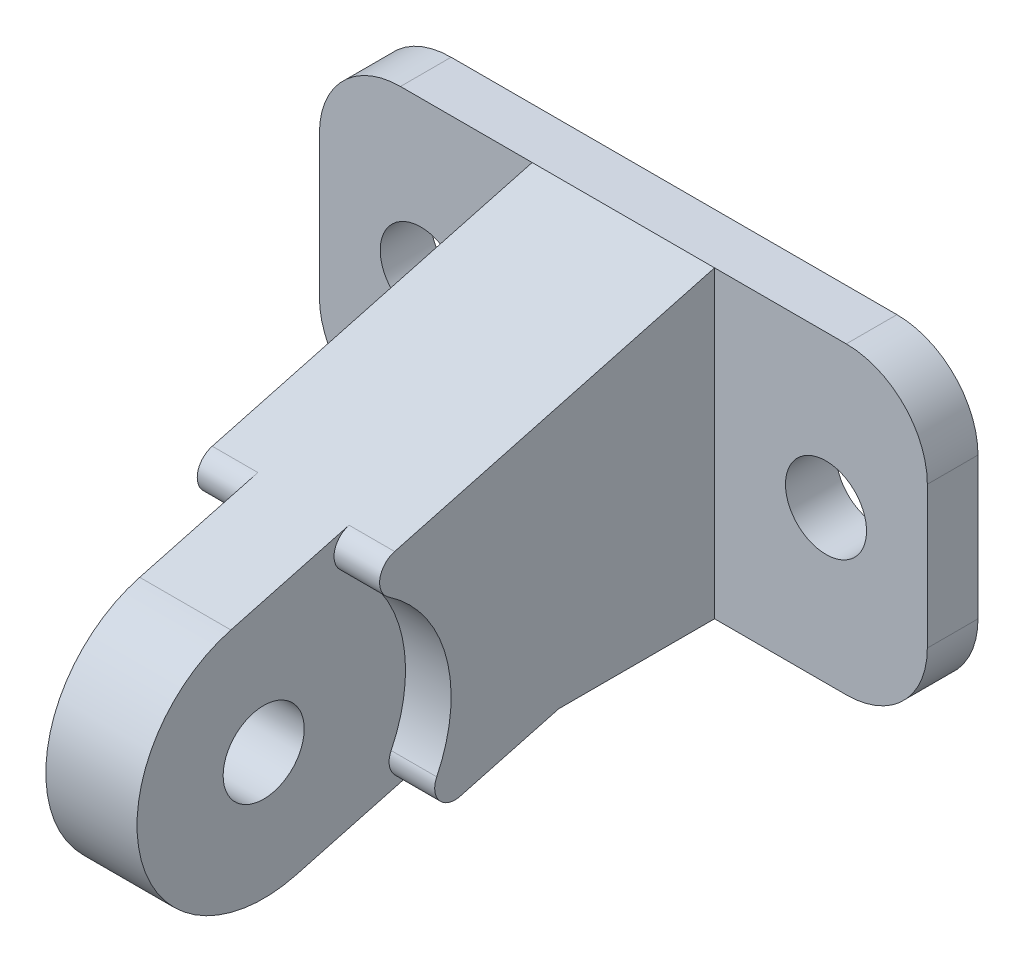
ISO-10303-21;
HEADER;
FILE_DESCRIPTION(('STEP AP214'),'2;1');
FILE_NAME('part.step','',(''),(''),'','','');
FILE_SCHEMA(('AUTOMOTIVE_DESIGN { 1 0 10303 214 1 1 1 1 }'));
ENDSEC;
DATA;
#1=APPLICATION_CONTEXT('core data for automotive mechanical design processes');
#2=APPLICATION_PROTOCOL_DEFINITION('international standard','automotive_design',2000,#1);
#3=PRODUCT_CONTEXT('',#1,'mechanical');
#4=PRODUCT('Part','Part','',(#3));
#5=PRODUCT_RELATED_PRODUCT_CATEGORY('part','',(#4));
#6=PRODUCT_DEFINITION_FORMATION('','',#4);
#7=PRODUCT_DEFINITION_CONTEXT('part definition',#1,'design');
#8=PRODUCT_DEFINITION('design','',#6,#7);
#9=PRODUCT_DEFINITION_SHAPE('','',#8);
#10=(LENGTH_UNIT() NAMED_UNIT(*) SI_UNIT(.MILLI.,.METRE.));
#11=(NAMED_UNIT(*) PLANE_ANGLE_UNIT() SI_UNIT($,.RADIAN.));
#12=(NAMED_UNIT(*) SI_UNIT($,.STERADIAN.) SOLID_ANGLE_UNIT());
#13=UNCERTAINTY_MEASURE_WITH_UNIT(LENGTH_MEASURE(1.E-05),#10,'distance_accuracy_value','');
#14=(GEOMETRIC_REPRESENTATION_CONTEXT(3) GLOBAL_UNCERTAINTY_ASSIGNED_CONTEXT((#13)) GLOBAL_UNIT_ASSIGNED_CONTEXT((#10,
#11,#12)) REPRESENTATION_CONTEXT('',''));
#15=CARTESIAN_POINT('',(0.,0.,0.));
#16=DIRECTION('',(0.,0.,1.));
#17=DIRECTION('',(1.,0.,0.));
#18=AXIS2_PLACEMENT_3D('',#15,#16,#17);
#19=CARTESIAN_POINT('',(9.,-8.65891995237099,42.5));
#20=DIRECTION('',(-1.,0.,0.));
#21=DIRECTION('',(0.,0.,1.));
#22=AXIS2_PLACEMENT_3D('',#19,#20,#21);
#23=CYLINDRICAL_SURFACE('',#22,12.5);
#24=CARTESIAN_POINT('',(-4.5,-8.65891995237099,42.5));
#25=DIRECTION('',(-1.,0.,0.));
#26=DIRECTION('',(0.,0.,1.));
#27=AXIS2_PLACEMENT_3D('',#24,#25,#26);
#28=CIRCLE('',#27,12.5);
#29=CARTESIAN_POINT('',(-4.5,-20.7329927809843,39.2647619362185));
#30=VERTEX_POINT('',#29);
#31=CARTESIAN_POINT('',(-4.5,3.41515287624236,45.7352380637815));
#32=VERTEX_POINT('',#31);
#33=EDGE_CURVE('E184',#30,#32,#28,.T.);
#34=ORIENTED_EDGE('',*,*,#33,.F.);
#35=DIRECTION('',(-1.,0.,0.));
#36=VECTOR('',#35,1.);
#37=CARTESIAN_POINT('',(9.,-20.7329927809843,39.2647619362185));
#38=LINE('',#37,#36);
#39=CARTESIAN_POINT('',(4.5,-20.7329927809843,39.2647619362185));
#40=VERTEX_POINT('',#39);
#41=EDGE_CURVE('E200',#40,#30,#38,.T.);
#42=ORIENTED_EDGE('',*,*,#41,.F.);
#43=CARTESIAN_POINT('',(4.5,-8.65891995237099,42.5));
#44=DIRECTION('',(1.,0.,0.));
#45=DIRECTION('',(0.,0.,-1.));
#46=AXIS2_PLACEMENT_3D('',#43,#44,#45);
#47=CIRCLE('',#46,12.5);
#48=CARTESIAN_POINT('',(4.5,3.41515287624236,45.7352380637815));
#49=VERTEX_POINT('',#48);
#50=EDGE_CURVE('E346',#49,#40,#47,.T.);
#51=ORIENTED_EDGE('',*,*,#50,.F.);
#52=DIRECTION('',(-1.,0.,0.));
#53=VECTOR('',#52,1.);
#54=CARTESIAN_POINT('',(9.,3.41515287624237,45.7352380637815));
#55=LINE('',#54,#53);
#56=EDGE_CURVE('E196',#49,#32,#55,.T.);
#57=ORIENTED_EDGE('',*,*,#56,.T.);
#58=EDGE_LOOP('',(#34,#42,#51,#57));
#59=FACE_BOUND('',#58,.T.);
#60=ADVANCED_FACE('F41',(#59),#23,.T.);
#61=CARTESIAN_POINT('',(9.,-8.65891995237099,42.5));
#62=DIRECTION('',(-1.,0.,0.));
#63=DIRECTION('',(0.,0.,1.));
#64=AXIS2_PLACEMENT_3D('',#61,#62,#63);
#65=CYLINDRICAL_SURFACE('',#64,4.);
#66=CARTESIAN_POINT('',(4.5,-8.65891995237099,42.5));
#67=DIRECTION('',(1.,0.,0.));
#68=DIRECTION('',(0.,0.,-1.));
#69=AXIS2_PLACEMENT_3D('',#66,#67,#68);
#70=CIRCLE('',#69,4.);
#71=CARTESIAN_POINT('',(4.5,-8.65891995237099,38.5));
#72=VERTEX_POINT('',#71);
#73=EDGE_CURVE('E292',#72,#72,#70,.T.);
#74=ORIENTED_EDGE('',*,*,#73,.T.);
#75=EDGE_LOOP('',(#74));
#76=FACE_BOUND('',#75,.T.);
#77=CARTESIAN_POINT('',(-4.5,-8.65891995237099,42.5));
#78=DIRECTION('',(-1.,0.,0.));
#79=DIRECTION('',(0.,0.,1.));
#80=AXIS2_PLACEMENT_3D('',#77,#78,#79);
#81=CIRCLE('',#80,4.);
#82=CARTESIAN_POINT('',(-4.5,-8.65891995237099,46.5));
#83=VERTEX_POINT('',#82);
#84=EDGE_CURVE('E338',#83,#83,#81,.T.);
#85=ORIENTED_EDGE('',*,*,#84,.T.);
#86=EDGE_LOOP('',(#85));
#87=FACE_BOUND('',#86,.T.);
#88=ADVANCED_FACE('F441',(#76,#87),#65,.F.);
#89=CARTESIAN_POINT('',(-9.,-8.65891995237099,42.5));
#90=DIRECTION('',(1.,0.,0.));
#91=DIRECTION('',(0.,0.,-1.));
#92=AXIS2_PLACEMENT_3D('',#89,#90,#91);
#93=PLANE('',#92);
#94=DIRECTION('',(0.,0.258819045102521,-0.965925826289068));
#95=VECTOR('',#94,1.);
#96=CARTESIAN_POINT('',(-9.,-20.7329927809843,39.2647619362185));
#97=LINE('',#96,#95);
#98=CARTESIAN_POINT('',(-9.,-17.6083490094147,27.6034326251669));
#99=VERTEX_POINT('',#98);
#100=CARTESIAN_POINT('',(-9.,-15.,17.8689415981594));
#101=VERTEX_POINT('',#100);
#102=EDGE_CURVE('E370',#99,#101,#97,.T.);
#103=ORIENTED_EDGE('',*,*,#102,.F.);
#104=CARTESIAN_POINT('',(-9.,-15.6764973568365,28.1210707153719));
#105=DIRECTION('',(1.,0.,0.));
#106=DIRECTION('',(0.,0.,-1.));
#107=AXIS2_PLACEMENT_3D('',#104,#105,#106);
#108=CIRCLE('',#107,2.);
#109=CARTESIAN_POINT('',(-9.,-14.7993001812783,29.9184368759504));
#110=VERTEX_POINT('',#109);
#111=EDGE_CURVE('E318',#99,#110,#108,.F.);
#112=ORIENTED_EDGE('',*,*,#111,.T.);
#113=CARTESIAN_POINT('',(-9.,-8.65891995237099,42.5));
#114=DIRECTION('',(1.,0.,0.));
#115=DIRECTION('',(0.,0.,-1.));
#116=AXIS2_PLACEMENT_3D('',#113,#114,#115);
#117=CIRCLE('',#116,14.);
#118=CARTESIAN_POINT('',(-9.,2.94958687678328,34.6742368297093));
#119=VERTEX_POINT('',#118);
#120=EDGE_CURVE('E334',#110,#119,#117,.T.);
#121=ORIENTED_EDGE('',*,*,#120,.T.);
#122=CARTESIAN_POINT('',(-9.,4.6079449952339,33.5562706625249));
#123=DIRECTION('',(1.,0.,0.));
#124=DIRECTION('',(0.,0.,-1.));
#125=AXIS2_PLACEMENT_3D('',#122,#123,#124);
#126=CIRCLE('',#125,2.);
#127=CARTESIAN_POINT('',(-9.,6.53979664781203,34.0739087527299));
#128=VERTEX_POINT('',#127);
#129=EDGE_CURVE('E64',#119,#128,#126,.F.);
#130=ORIENTED_EDGE('',*,*,#129,.T.);
#131=DIRECTION('',(0.,-0.258819045102521,0.965925826289068));
#132=VECTOR('',#131,1.);
#133=CARTESIAN_POINT('',(-9.,15.,2.5));
#134=LINE('',#133,#132);
#135=CARTESIAN_POINT('',(-9.,15.,2.5));
#136=VERTEX_POINT('',#135);
#137=EDGE_CURVE('E330',#136,#128,#134,.T.);
#138=ORIENTED_EDGE('',*,*,#137,.F.);
#139=DIRECTION('',(0.,1.,0.));
#140=VECTOR('',#139,1.);
#141=CARTESIAN_POINT('',(-9.,-15.,2.5));
#142=LINE('',#141,#140);
#143=CARTESIAN_POINT('',(-9.,-15.,2.5));
#144=VERTEX_POINT('',#143);
#145=EDGE_CURVE('E353',#144,#136,#142,.T.);
#146=ORIENTED_EDGE('',*,*,#145,.F.);
#147=DIRECTION('',(0.,0.,-1.));
#148=VECTOR('',#147,1.);
#149=CARTESIAN_POINT('',(-9.,-15.,17.8689415981594));
#150=LINE('',#149,#148);
#151=EDGE_CURVE('E356',#101,#144,#150,.T.);
#152=ORIENTED_EDGE('',*,*,#151,.F.);
#153=EDGE_LOOP('',(#103,#112,#121,#130,#138,#146,#152));
#154=FACE_BOUND('',#153,.T.);
#155=ADVANCED_FACE('F377',(#154),#93,.F.);
#156=CARTESIAN_POINT('',(9.,15.,2.5));
#157=DIRECTION('',(0.,-0.965925826289068,-0.258819045102521));
#158=DIRECTION('',(0.,0.258819045102521,-0.965925826289068));
#159=AXIS2_PLACEMENT_3D('',#156,#157,#158);
#160=PLANE('',#159);
#161=ORIENTED_EDGE('',*,*,#137,.T.);
#162=DIRECTION('',(1.,0.,0.));
#163=VECTOR('',#162,1.);
#164=CARTESIAN_POINT('',(-4.5,6.53979664781203,34.0739087527299));
#165=LINE('',#164,#163);
#166=CARTESIAN_POINT('',(-4.5,6.53979664781203,34.0739087527299));
#167=VERTEX_POINT('',#166);
#168=EDGE_CURVE('E322',#128,#167,#165,.T.);
#169=ORIENTED_EDGE('',*,*,#168,.T.);
#170=DIRECTION('',(0.,0.258819045102521,-0.965925826289068));
#171=VECTOR('',#170,1.);
#172=CARTESIAN_POINT('',(-4.5,15.,2.5));
#173=LINE('',#172,#171);
#174=EDGE_CURVE('E54',#32,#167,#173,.T.);
#175=ORIENTED_EDGE('',*,*,#174,.F.);
#176=ORIENTED_EDGE('',*,*,#56,.F.);
#177=DIRECTION('',(0.,-0.258819045102521,0.965925826289068));
#178=VECTOR('',#177,1.);
#179=CARTESIAN_POINT('',(4.5,15.,2.5));
#180=LINE('',#179,#178);
#181=CARTESIAN_POINT('',(4.5,6.53979664781203,34.0739087527299));
#182=VERTEX_POINT('',#181);
#183=EDGE_CURVE('E351',#182,#49,#180,.T.);
#184=ORIENTED_EDGE('',*,*,#183,.F.);
#185=DIRECTION('',(1.,0.,0.));
#186=VECTOR('',#185,1.);
#187=CARTESIAN_POINT('',(9.,6.53979664781203,34.0739087527299));
#188=LINE('',#187,#186);
#189=CARTESIAN_POINT('',(9.,6.53979664781203,34.0739087527299));
#190=VERTEX_POINT('',#189);
#191=EDGE_CURVE('E304',#182,#190,#188,.T.);
#192=ORIENTED_EDGE('',*,*,#191,.T.);
#193=DIRECTION('',(0.,-0.258819045102521,0.965925826289068));
#194=VECTOR('',#193,1.);
#195=CARTESIAN_POINT('',(9.,15.,2.5));
#196=LINE('',#195,#194);
#197=CARTESIAN_POINT('',(9.,15.,2.5));
#198=VERTEX_POINT('',#197);
#199=EDGE_CURVE('E357',#198,#190,#196,.T.);
#200=ORIENTED_EDGE('',*,*,#199,.F.);
#201=DIRECTION('',(-1.,0.,0.));
#202=VECTOR('',#201,1.);
#203=CARTESIAN_POINT('',(9.,15.,2.5));
#204=LINE('',#203,#202);
#205=EDGE_CURVE('E206',#198,#136,#204,.T.);
#206=ORIENTED_EDGE('',*,*,#205,.T.);
#207=EDGE_LOOP('',(#161,#169,#175,#176,#184,#192,#200,#206));
#208=FACE_BOUND('',#207,.T.);
#209=ADVANCED_FACE('F327',(#208),#160,.F.);
#210=CARTESIAN_POINT('',(9.,-20.7329927809843,39.2647619362185));
#211=DIRECTION('',(0.,0.965925826289068,0.258819045102521));
#212=DIRECTION('',(0.,-0.258819045102521,0.965925826289068));
#213=AXIS2_PLACEMENT_3D('',#210,#211,#212);
#214=PLANE('',#213);
#215=DIRECTION('',(0.,-0.258819045102521,0.965925826289068));
#216=VECTOR('',#215,1.);
#217=CARTESIAN_POINT('',(-4.5,-20.7329927809843,39.2647619362185));
#218=LINE('',#217,#216);
#219=CARTESIAN_POINT('',(-4.5,-17.6083490094147,27.6034326251669));
#220=VERTEX_POINT('',#219);
#221=EDGE_CURVE('E185',#220,#30,#218,.T.);
#222=ORIENTED_EDGE('',*,*,#221,.F.);
#223=DIRECTION('',(1.,0.,0.));
#224=VECTOR('',#223,1.);
#225=CARTESIAN_POINT('',(-9.,-17.6083490094147,27.6034326251669));
#226=LINE('',#225,#224);
#227=EDGE_CURVE('E320',#220,#99,#226,.F.);
#228=ORIENTED_EDGE('',*,*,#227,.T.);
#229=ORIENTED_EDGE('',*,*,#102,.T.);
#230=DIRECTION('',(-1.,0.,0.));
#231=VECTOR('',#230,1.);
#232=CARTESIAN_POINT('',(9.,-15.,17.8689415981594));
#233=LINE('',#232,#231);
#234=CARTESIAN_POINT('',(9.,-15.,17.8689415981594));
#235=VERTEX_POINT('',#234);
#236=EDGE_CURVE('E207',#235,#101,#233,.T.);
#237=ORIENTED_EDGE('',*,*,#236,.F.);
#238=DIRECTION('',(0.,0.258819045102521,-0.965925826289068));
#239=VECTOR('',#238,1.);
#240=CARTESIAN_POINT('',(9.,-20.7329927809843,39.2647619362185));
#241=LINE('',#240,#239);
#242=CARTESIAN_POINT('',(9.,-17.6083490094147,27.6034326251669));
#243=VERTEX_POINT('',#242);
#244=EDGE_CURVE('E363',#243,#235,#241,.T.);
#245=ORIENTED_EDGE('',*,*,#244,.F.);
#246=DIRECTION('',(1.,0.,0.));
#247=VECTOR('',#246,1.);
#248=CARTESIAN_POINT('',(9.,-17.6083490094147,27.6034326251669));
#249=LINE('',#248,#247);
#250=CARTESIAN_POINT('',(4.5,-17.6083490094147,27.6034326251669));
#251=VERTEX_POINT('',#250);
#252=EDGE_CURVE('E293',#243,#251,#249,.F.);
#253=ORIENTED_EDGE('',*,*,#252,.T.);
#254=DIRECTION('',(0.,0.258819045102521,-0.965925826289068));
#255=VECTOR('',#254,1.);
#256=CARTESIAN_POINT('',(4.5,-20.7329927809843,39.2647619362185));
#257=LINE('',#256,#255);
#258=EDGE_CURVE('E204',#40,#251,#257,.T.);
#259=ORIENTED_EDGE('',*,*,#258,.F.);
#260=ORIENTED_EDGE('',*,*,#41,.T.);
#261=EDGE_LOOP('',(#222,#228,#229,#237,#245,#253,#259,#260));
#262=FACE_BOUND('',#261,.T.);
#263=ADVANCED_FACE('F203',(#262),#214,.F.);
#264=CARTESIAN_POINT('',(0.,0.,2.5));
#265=DIRECTION('',(0.,0.,1.));
#266=DIRECTION('',(1.,0.,0.));
#267=AXIS2_PLACEMENT_3D('',#264,#265,#266);
#268=PLANE('',#267);
#269=CARTESIAN_POINT('',(-20.,0.,2.5));
#270=DIRECTION('',(0.,0.,1.));
#271=DIRECTION('',(1.,0.,0.));
#272=AXIS2_PLACEMENT_3D('',#269,#270,#271);
#273=CIRCLE('',#272,4.);
#274=CARTESIAN_POINT('',(-16.,0.,2.5));
#275=VERTEX_POINT('',#274);
#276=EDGE_CURVE('E222',#275,#275,#273,.T.);
#277=ORIENTED_EDGE('',*,*,#276,.F.);
#278=EDGE_LOOP('',(#277));
#279=FACE_BOUND('',#278,.T.);
#280=DIRECTION('',(1.,0.,0.));
#281=VECTOR('',#280,1.);
#282=CARTESIAN_POINT('',(-30.,-15.,2.5));
#283=LINE('',#282,#281);
#284=CARTESIAN_POINT('',(-22.,-15.,2.5));
#285=VERTEX_POINT('',#284);
#286=EDGE_CURVE('E241',#285,#144,#283,.T.);
#287=ORIENTED_EDGE('',*,*,#286,.T.);
#288=ORIENTED_EDGE('',*,*,#145,.T.);
#289=DIRECTION('',(-1.,0.,0.));
#290=VECTOR('',#289,1.);
#291=CARTESIAN_POINT('',(-30.,15.,2.5));
#292=LINE('',#291,#290);
#293=CARTESIAN_POINT('',(-22.,15.,2.5));
#294=VERTEX_POINT('',#293);
#295=EDGE_CURVE('E231',#136,#294,#292,.T.);
#296=ORIENTED_EDGE('',*,*,#295,.T.);
#297=CARTESIAN_POINT('',(-22.,7.,2.5));
#298=DIRECTION('',(0.,0.,1.));
#299=DIRECTION('',(1.,0.,0.));
#300=AXIS2_PLACEMENT_3D('',#297,#298,#299);
#301=CIRCLE('',#300,8.);
#302=CARTESIAN_POINT('',(-30.,7.,2.5));
#303=VERTEX_POINT('',#302);
#304=EDGE_CURVE('E275',#294,#303,#301,.T.);
#305=ORIENTED_EDGE('',*,*,#304,.T.);
#306=DIRECTION('',(0.,-1.,0.));
#307=VECTOR('',#306,1.);
#308=CARTESIAN_POINT('',(-30.,15.,2.5));
#309=LINE('',#308,#307);
#310=CARTESIAN_POINT('',(-30.,-7.,2.5));
#311=VERTEX_POINT('',#310);
#312=EDGE_CURVE('E240',#303,#311,#309,.T.);
#313=ORIENTED_EDGE('',*,*,#312,.T.);
#314=CARTESIAN_POINT('',(-22.,-7.,2.5));
#315=DIRECTION('',(0.,0.,1.));
#316=DIRECTION('',(1.,0.,0.));
#317=AXIS2_PLACEMENT_3D('',#314,#315,#316);
#318=CIRCLE('',#317,8.);
#319=EDGE_CURVE('E276',#311,#285,#318,.T.);
#320=ORIENTED_EDGE('',*,*,#319,.T.);
#321=EDGE_LOOP('',(#287,#288,#296,#305,#313,#320));
#322=FACE_BOUND('',#321,.T.);
#323=ADVANCED_FACE('F382',(#279,#322),#268,.T.);
#324=DIRECTION('',(0.,1.,0.));
#325=VECTOR('',#324,1.);
#326=CARTESIAN_POINT('',(9.,-15.,2.5));
#327=LINE('',#326,#325);
#328=CARTESIAN_POINT('',(9.,-15.,2.5));
#329=VERTEX_POINT('',#328);
#330=EDGE_CURVE('E352',#329,#198,#327,.T.);
#331=ORIENTED_EDGE('',*,*,#330,.F.);
#332=CARTESIAN_POINT('',(22.,-15.,2.5));
#333=VERTEX_POINT('',#332);
#334=EDGE_CURVE('E239',#329,#333,#283,.T.);
#335=ORIENTED_EDGE('',*,*,#334,.T.);
#336=CARTESIAN_POINT('',(22.,-7.,2.5));
#337=DIRECTION('',(0.,0.,1.));
#338=DIRECTION('',(1.,0.,0.));
#339=AXIS2_PLACEMENT_3D('',#336,#337,#338);
#340=CIRCLE('',#339,8.);
#341=CARTESIAN_POINT('',(30.,-7.,2.5));
#342=VERTEX_POINT('',#341);
#343=EDGE_CURVE('E279',#333,#342,#340,.T.);
#344=ORIENTED_EDGE('',*,*,#343,.T.);
#345=DIRECTION('',(0.,1.,0.));
#346=VECTOR('',#345,1.);
#347=CARTESIAN_POINT('',(30.,15.,2.5));
#348=LINE('',#347,#346);
#349=CARTESIAN_POINT('',(30.,7.,2.5));
#350=VERTEX_POINT('',#349);
#351=EDGE_CURVE('E229',#342,#350,#348,.T.);
#352=ORIENTED_EDGE('',*,*,#351,.T.);
#353=CARTESIAN_POINT('',(22.,7.,2.5));
#354=DIRECTION('',(0.,0.,1.));
#355=DIRECTION('',(1.,0.,0.));
#356=AXIS2_PLACEMENT_3D('',#353,#354,#355);
#357=CIRCLE('',#356,8.);
#358=CARTESIAN_POINT('',(22.,15.,2.5));
#359=VERTEX_POINT('',#358);
#360=EDGE_CURVE('E274',#350,#359,#357,.T.);
#361=ORIENTED_EDGE('',*,*,#360,.T.);
#362=EDGE_CURVE('E232',#359,#198,#292,.T.);
#363=ORIENTED_EDGE('',*,*,#362,.T.);
#364=EDGE_LOOP('',(#331,#335,#344,#352,#361,#363));
#365=FACE_BOUND('',#364,.T.);
#366=CARTESIAN_POINT('',(20.,0.,2.5));
#367=DIRECTION('',(0.,0.,1.));
#368=DIRECTION('',(-1.,0.,0.));
#369=AXIS2_PLACEMENT_3D('',#366,#367,#368);
#370=CIRCLE('',#369,4.);
#371=CARTESIAN_POINT('',(16.,0.,2.5));
#372=VERTEX_POINT('',#371);
#373=EDGE_CURVE('E219',#372,#372,#370,.T.);
#374=ORIENTED_EDGE('',*,*,#373,.F.);
#375=EDGE_LOOP('',(#374));
#376=FACE_BOUND('',#375,.T.);
#377=ADVANCED_FACE('F420',(#365,#376),#268,.T.);
#378=CARTESIAN_POINT('',(0.,0.,-2.5));
#379=DIRECTION('',(0.,0.,1.));
#380=DIRECTION('',(1.,0.,0.));
#381=AXIS2_PLACEMENT_3D('',#378,#379,#380);
#382=PLANE('',#381);
#383=DIRECTION('',(0.,1.,0.));
#384=VECTOR('',#383,1.);
#385=CARTESIAN_POINT('',(30.,15.,-2.5));
#386=LINE('',#385,#384);
#387=CARTESIAN_POINT('',(30.,-7.,-2.5));
#388=VERTEX_POINT('',#387);
#389=CARTESIAN_POINT('',(30.,7.,-2.5));
#390=VERTEX_POINT('',#389);
#391=EDGE_CURVE('E227',#388,#390,#386,.T.);
#392=ORIENTED_EDGE('',*,*,#391,.F.);
#393=CARTESIAN_POINT('',(22.,-7.,-2.5));
#394=DIRECTION('',(0.,0.,1.));
#395=DIRECTION('',(1.,0.,0.));
#396=AXIS2_PLACEMENT_3D('',#393,#394,#395);
#397=CIRCLE('',#396,8.);
#398=CARTESIAN_POINT('',(22.,-15.,-2.5));
#399=VERTEX_POINT('',#398);
#400=EDGE_CURVE('E261',#388,#399,#397,.F.);
#401=ORIENTED_EDGE('',*,*,#400,.T.);
#402=DIRECTION('',(1.,0.,0.));
#403=VECTOR('',#402,1.);
#404=CARTESIAN_POINT('',(-30.,-15.,-2.5));
#405=LINE('',#404,#403);
#406=CARTESIAN_POINT('',(-22.,-15.,-2.5));
#407=VERTEX_POINT('',#406);
#408=EDGE_CURVE('E234',#407,#399,#405,.T.);
#409=ORIENTED_EDGE('',*,*,#408,.F.);
#410=CARTESIAN_POINT('',(-22.,-7.,-2.5));
#411=DIRECTION('',(0.,0.,1.));
#412=DIRECTION('',(1.,0.,0.));
#413=AXIS2_PLACEMENT_3D('',#410,#411,#412);
#414=CIRCLE('',#413,8.);
#415=CARTESIAN_POINT('',(-30.,-7.,-2.5));
#416=VERTEX_POINT('',#415);
#417=EDGE_CURVE('E265',#407,#416,#414,.F.);
#418=ORIENTED_EDGE('',*,*,#417,.T.);
#419=DIRECTION('',(0.,-1.,0.));
#420=VECTOR('',#419,1.);
#421=CARTESIAN_POINT('',(-30.,15.,-2.5));
#422=LINE('',#421,#420);
#423=CARTESIAN_POINT('',(-30.,7.,-2.5));
#424=VERTEX_POINT('',#423);
#425=EDGE_CURVE('E248',#424,#416,#422,.T.);
#426=ORIENTED_EDGE('',*,*,#425,.F.);
#427=CARTESIAN_POINT('',(-22.,7.,-2.5));
#428=DIRECTION('',(0.,0.,1.));
#429=DIRECTION('',(1.,0.,0.));
#430=AXIS2_PLACEMENT_3D('',#427,#428,#429);
#431=CIRCLE('',#430,8.);
#432=CARTESIAN_POINT('',(-22.,15.,-2.5));
#433=VERTEX_POINT('',#432);
#434=EDGE_CURVE('E259',#424,#433,#431,.F.);
#435=ORIENTED_EDGE('',*,*,#434,.T.);
#436=DIRECTION('',(-1.,0.,0.));
#437=VECTOR('',#436,1.);
#438=CARTESIAN_POINT('',(-30.,15.,-2.5));
#439=LINE('',#438,#437);
#440=CARTESIAN_POINT('',(22.,15.,-2.5));
#441=VERTEX_POINT('',#440);
#442=EDGE_CURVE('E246',#441,#433,#439,.T.);
#443=ORIENTED_EDGE('',*,*,#442,.F.);
#444=CARTESIAN_POINT('',(22.,7.,-2.5));
#445=DIRECTION('',(0.,0.,1.));
#446=DIRECTION('',(1.,0.,0.));
#447=AXIS2_PLACEMENT_3D('',#444,#445,#446);
#448=CIRCLE('',#447,8.);
#449=EDGE_CURVE('E260',#441,#390,#448,.F.);
#450=ORIENTED_EDGE('',*,*,#449,.T.);
#451=EDGE_LOOP('',(#392,#401,#409,#418,#426,#435,#443,#450));
#452=FACE_BOUND('',#451,.T.);
#453=CARTESIAN_POINT('',(-20.,0.,-2.5));
#454=DIRECTION('',(0.,0.,1.));
#455=DIRECTION('',(1.,0.,0.));
#456=AXIS2_PLACEMENT_3D('',#453,#454,#455);
#457=CIRCLE('',#456,4.);
#458=CARTESIAN_POINT('',(-16.,0.,-2.5));
#459=VERTEX_POINT('',#458);
#460=EDGE_CURVE('E221',#459,#459,#457,.T.);
#461=ORIENTED_EDGE('',*,*,#460,.T.);
#462=EDGE_LOOP('',(#461));
#463=FACE_BOUND('',#462,.T.);
#464=CARTESIAN_POINT('',(20.,0.,-2.5));
#465=DIRECTION('',(0.,0.,1.));
#466=DIRECTION('',(-1.,0.,0.));
#467=AXIS2_PLACEMENT_3D('',#464,#465,#466);
#468=CIRCLE('',#467,4.);
#469=CARTESIAN_POINT('',(16.,0.,-2.5));
#470=VERTEX_POINT('',#469);
#471=EDGE_CURVE('E220',#470,#470,#468,.T.);
#472=ORIENTED_EDGE('',*,*,#471,.T.);
#473=EDGE_LOOP('',(#472));
#474=FACE_BOUND('',#473,.T.);
#475=ADVANCED_FACE('F403',(#452,#463,#474),#382,.F.);
#476=CARTESIAN_POINT('',(30.,15.,2.5));
#477=DIRECTION('',(-1.,0.,0.));
#478=DIRECTION('',(0.,0.,1.));
#479=AXIS2_PLACEMENT_3D('',#476,#477,#478);
#480=PLANE('',#479);
#481=ORIENTED_EDGE('',*,*,#351,.F.);
#482=DIRECTION('',(0.,0.,-1.));
#483=VECTOR('',#482,1.);
#484=CARTESIAN_POINT('',(30.,-7.,2.5));
#485=LINE('',#484,#483);
#486=EDGE_CURVE('E253',#342,#388,#485,.T.);
#487=ORIENTED_EDGE('',*,*,#486,.T.);
#488=ORIENTED_EDGE('',*,*,#391,.T.);
#489=DIRECTION('',(0.,0.,-1.));
#490=VECTOR('',#489,1.);
#491=CARTESIAN_POINT('',(30.,7.,2.5));
#492=LINE('',#491,#490);
#493=EDGE_CURVE('E243',#390,#350,#492,.F.);
#494=ORIENTED_EDGE('',*,*,#493,.T.);
#495=EDGE_LOOP('',(#481,#487,#488,#494));
#496=FACE_BOUND('',#495,.T.);
#497=ADVANCED_FACE('F414',(#496),#480,.F.);
#498=CARTESIAN_POINT('',(-30.,15.,2.5));
#499=DIRECTION('',(0.,-1.,0.));
#500=DIRECTION('',(0.,0.,-1.));
#501=AXIS2_PLACEMENT_3D('',#498,#499,#500);
#502=PLANE('',#501);
#503=ORIENTED_EDGE('',*,*,#362,.F.);
#504=DIRECTION('',(0.,0.,-1.));
#505=VECTOR('',#504,1.);
#506=CARTESIAN_POINT('',(22.,15.,2.5));
#507=LINE('',#506,#505);
#508=EDGE_CURVE('E288',#359,#441,#507,.T.);
#509=ORIENTED_EDGE('',*,*,#508,.T.);
#510=ORIENTED_EDGE('',*,*,#442,.T.);
#511=DIRECTION('',(0.,0.,-1.));
#512=VECTOR('',#511,1.);
#513=CARTESIAN_POINT('',(-22.,15.,2.5));
#514=LINE('',#513,#512);
#515=EDGE_CURVE('E283',#433,#294,#514,.F.);
#516=ORIENTED_EDGE('',*,*,#515,.T.);
#517=ORIENTED_EDGE('',*,*,#295,.F.);
#518=ORIENTED_EDGE('',*,*,#205,.F.);
#519=EDGE_LOOP('',(#503,#509,#510,#516,#517,#518));
#520=FACE_BOUND('',#519,.T.);
#521=ADVANCED_FACE('F383',(#520),#502,.F.);
#522=CARTESIAN_POINT('',(-30.,15.,2.5));
#523=DIRECTION('',(1.,0.,0.));
#524=DIRECTION('',(0.,0.,-1.));
#525=AXIS2_PLACEMENT_3D('',#522,#523,#524);
#526=PLANE('',#525);
#527=ORIENTED_EDGE('',*,*,#425,.T.);
#528=DIRECTION('',(0.,0.,-1.));
#529=VECTOR('',#528,1.);
#530=CARTESIAN_POINT('',(-30.,-7.,2.5));
#531=LINE('',#530,#529);
#532=EDGE_CURVE('E284',#416,#311,#531,.F.);
#533=ORIENTED_EDGE('',*,*,#532,.T.);
#534=ORIENTED_EDGE('',*,*,#312,.F.);
#535=DIRECTION('',(0.,0.,-1.));
#536=VECTOR('',#535,1.);
#537=CARTESIAN_POINT('',(-30.,7.,2.5));
#538=LINE('',#537,#536);
#539=EDGE_CURVE('E280',#303,#424,#538,.T.);
#540=ORIENTED_EDGE('',*,*,#539,.T.);
#541=EDGE_LOOP('',(#527,#533,#534,#540));
#542=FACE_BOUND('',#541,.T.);
#543=ADVANCED_FACE('F396',(#542),#526,.F.);
#544=CARTESIAN_POINT('',(-30.,-15.,2.5));
#545=DIRECTION('',(0.,1.,0.));
#546=DIRECTION('',(0.,0.,1.));
#547=AXIS2_PLACEMENT_3D('',#544,#545,#546);
#548=PLANE('',#547);
#549=ORIENTED_EDGE('',*,*,#408,.T.);
#550=DIRECTION('',(0.,0.,-1.));
#551=VECTOR('',#550,1.);
#552=CARTESIAN_POINT('',(22.,-15.,2.5));
#553=LINE('',#552,#551);
#554=EDGE_CURVE('E267',#399,#333,#553,.F.);
#555=ORIENTED_EDGE('',*,*,#554,.T.);
#556=ORIENTED_EDGE('',*,*,#334,.F.);
#557=DIRECTION('',(0.,0.,-1.));
#558=VECTOR('',#557,1.);
#559=CARTESIAN_POINT('',(9.,-15.,17.8689415981594));
#560=LINE('',#559,#558);
#561=EDGE_CURVE('E211',#235,#329,#560,.T.);
#562=ORIENTED_EDGE('',*,*,#561,.F.);
#563=ORIENTED_EDGE('',*,*,#236,.T.);
#564=ORIENTED_EDGE('',*,*,#151,.T.);
#565=ORIENTED_EDGE('',*,*,#286,.F.);
#566=DIRECTION('',(0.,0.,-1.));
#567=VECTOR('',#566,1.);
#568=CARTESIAN_POINT('',(-22.,-15.,2.5));
#569=LINE('',#568,#567);
#570=EDGE_CURVE('E266',#285,#407,#569,.T.);
#571=ORIENTED_EDGE('',*,*,#570,.T.);
#572=EDGE_LOOP('',(#549,#555,#556,#562,#563,#564,#565,#571));
#573=FACE_BOUND('',#572,.T.);
#574=ADVANCED_FACE('F373',(#573),#548,.F.);
#575=CARTESIAN_POINT('',(-20.,0.,2.5));
#576=DIRECTION('',(0.,0.,-1.));
#577=DIRECTION('',(-1.,0.,0.));
#578=AXIS2_PLACEMENT_3D('',#575,#576,#577);
#579=CYLINDRICAL_SURFACE('',#578,4.);
#580=ORIENTED_EDGE('',*,*,#276,.T.);
#581=EDGE_LOOP('',(#580));
#582=FACE_BOUND('',#581,.T.);
#583=ORIENTED_EDGE('',*,*,#460,.F.);
#584=EDGE_LOOP('',(#583));
#585=FACE_BOUND('',#584,.T.);
#586=ADVANCED_FACE('F460',(#582,#585),#579,.F.);
#587=CARTESIAN_POINT('',(20.,0.,2.5));
#588=DIRECTION('',(0.,0.,-1.));
#589=DIRECTION('',(-1.,0.,0.));
#590=AXIS2_PLACEMENT_3D('',#587,#588,#589);
#591=CYLINDRICAL_SURFACE('',#590,4.);
#592=ORIENTED_EDGE('',*,*,#373,.T.);
#593=EDGE_LOOP('',(#592));
#594=FACE_BOUND('',#593,.T.);
#595=ORIENTED_EDGE('',*,*,#471,.F.);
#596=EDGE_LOOP('',(#595));
#597=FACE_BOUND('',#596,.T.);
#598=ADVANCED_FACE('F453',(#594,#597),#591,.F.);
#599=CARTESIAN_POINT('',(22.,-7.,2.5));
#600=DIRECTION('',(0.,0.,-1.));
#601=DIRECTION('',(-1.,0.,0.));
#602=AXIS2_PLACEMENT_3D('',#599,#600,#601);
#603=CYLINDRICAL_SURFACE('',#602,8.);
#604=ORIENTED_EDGE('',*,*,#343,.F.);
#605=ORIENTED_EDGE('',*,*,#554,.F.);
#606=ORIENTED_EDGE('',*,*,#400,.F.);
#607=ORIENTED_EDGE('',*,*,#486,.F.);
#608=EDGE_LOOP('',(#604,#605,#606,#607));
#609=FACE_BOUND('',#608,.T.);
#610=ADVANCED_FACE('F410',(#609),#603,.T.);
#611=CARTESIAN_POINT('',(-22.,-7.,2.5));
#612=DIRECTION('',(0.,0.,-1.));
#613=DIRECTION('',(-1.,0.,0.));
#614=AXIS2_PLACEMENT_3D('',#611,#612,#613);
#615=CYLINDRICAL_SURFACE('',#614,8.);
#616=ORIENTED_EDGE('',*,*,#319,.F.);
#617=ORIENTED_EDGE('',*,*,#532,.F.);
#618=ORIENTED_EDGE('',*,*,#417,.F.);
#619=ORIENTED_EDGE('',*,*,#570,.F.);
#620=EDGE_LOOP('',(#616,#617,#618,#619));
#621=FACE_BOUND('',#620,.T.);
#622=ADVANCED_FACE('F399',(#621),#615,.T.);
#623=CARTESIAN_POINT('',(22.,7.,2.5));
#624=DIRECTION('',(0.,0.,-1.));
#625=DIRECTION('',(-1.,0.,0.));
#626=AXIS2_PLACEMENT_3D('',#623,#624,#625);
#627=CYLINDRICAL_SURFACE('',#626,8.);
#628=ORIENTED_EDGE('',*,*,#360,.F.);
#629=ORIENTED_EDGE('',*,*,#493,.F.);
#630=ORIENTED_EDGE('',*,*,#449,.F.);
#631=ORIENTED_EDGE('',*,*,#508,.F.);
#632=EDGE_LOOP('',(#628,#629,#630,#631));
#633=FACE_BOUND('',#632,.T.);
#634=ADVANCED_FACE('F423',(#633),#627,.T.);
#635=CARTESIAN_POINT('',(-22.,7.,2.5));
#636=DIRECTION('',(0.,0.,-1.));
#637=DIRECTION('',(-1.,0.,0.));
#638=AXIS2_PLACEMENT_3D('',#635,#636,#637);
#639=CYLINDRICAL_SURFACE('',#638,8.);
#640=ORIENTED_EDGE('',*,*,#304,.F.);
#641=ORIENTED_EDGE('',*,*,#515,.F.);
#642=ORIENTED_EDGE('',*,*,#434,.F.);
#643=ORIENTED_EDGE('',*,*,#539,.F.);
#644=EDGE_LOOP('',(#640,#641,#642,#643));
#645=FACE_BOUND('',#644,.T.);
#646=ADVANCED_FACE('F395',(#645),#639,.T.);
#647=CARTESIAN_POINT('',(9.,-8.65891995237099,42.5));
#648=DIRECTION('',(1.,0.,0.));
#649=DIRECTION('',(0.,0.,-1.));
#650=AXIS2_PLACEMENT_3D('',#647,#648,#649);
#651=PLANE('',#650);
#652=CARTESIAN_POINT('',(9.,-8.65891995237099,42.5));
#653=DIRECTION('',(1.,0.,0.));
#654=DIRECTION('',(0.,0.,-1.));
#655=AXIS2_PLACEMENT_3D('',#652,#653,#654);
#656=CIRCLE('',#655,14.);
#657=CARTESIAN_POINT('',(9.,-14.7993001812783,29.9184368759504));
#658=VERTEX_POINT('',#657);
#659=CARTESIAN_POINT('',(9.,2.94958687678328,34.6742368297093));
#660=VERTEX_POINT('',#659);
#661=EDGE_CURVE('E344',#658,#660,#656,.T.);
#662=ORIENTED_EDGE('',*,*,#661,.F.);
#663=CARTESIAN_POINT('',(9.,-15.6764973568365,28.1210707153719));
#664=DIRECTION('',(1.,0.,0.));
#665=DIRECTION('',(0.,0.,-1.));
#666=AXIS2_PLACEMENT_3D('',#663,#664,#665);
#667=CIRCLE('',#666,2.);
#668=EDGE_CURVE('E303',#658,#243,#667,.T.);
#669=ORIENTED_EDGE('',*,*,#668,.T.);
#670=ORIENTED_EDGE('',*,*,#244,.T.);
#671=ORIENTED_EDGE('',*,*,#561,.T.);
#672=ORIENTED_EDGE('',*,*,#330,.T.);
#673=ORIENTED_EDGE('',*,*,#199,.T.);
#674=CARTESIAN_POINT('',(9.,4.6079449952339,33.5562706625249));
#675=DIRECTION('',(1.,0.,0.));
#676=DIRECTION('',(0.,0.,-1.));
#677=AXIS2_PLACEMENT_3D('',#674,#675,#676);
#678=CIRCLE('',#677,2.);
#679=EDGE_CURVE('E301',#190,#660,#678,.T.);
#680=ORIENTED_EDGE('',*,*,#679,.T.);
#681=EDGE_LOOP('',(#662,#669,#670,#671,#672,#673,#680));
#682=FACE_BOUND('',#681,.T.);
#683=ADVANCED_FACE('F424',(#682),#651,.T.);
#684=CARTESIAN_POINT('',(4.5,-8.65891995237099,42.5));
#685=DIRECTION('',(1.,0.,0.));
#686=DIRECTION('',(0.,0.,-1.));
#687=AXIS2_PLACEMENT_3D('',#684,#685,#686);
#688=CYLINDRICAL_SURFACE('',#687,14.);
#689=CARTESIAN_POINT('',(4.5,-8.65891995237099,42.5));
#690=DIRECTION('',(1.,0.,0.));
#691=DIRECTION('',(0.,0.,-1.));
#692=AXIS2_PLACEMENT_3D('',#689,#690,#691);
#693=CIRCLE('',#692,14.);
#694=CARTESIAN_POINT('',(4.5,-14.7993001812783,29.9184368759504));
#695=VERTEX_POINT('',#694);
#696=CARTESIAN_POINT('',(4.5,2.94958687678328,34.6742368297093));
#697=VERTEX_POINT('',#696);
#698=EDGE_CURVE('E294',#695,#697,#693,.T.);
#699=ORIENTED_EDGE('',*,*,#698,.F.);
#700=DIRECTION('',(1.,0.,0.));
#701=VECTOR('',#700,1.);
#702=CARTESIAN_POINT('',(4.5,-14.7993001812783,29.9184368759504));
#703=LINE('',#702,#701);
#704=EDGE_CURVE('E299',#695,#658,#703,.T.);
#705=ORIENTED_EDGE('',*,*,#704,.T.);
#706=ORIENTED_EDGE('',*,*,#661,.T.);
#707=DIRECTION('',(1.,0.,0.));
#708=VECTOR('',#707,1.);
#709=CARTESIAN_POINT('',(4.5,2.94958687678329,34.6742368297093));
#710=LINE('',#709,#708);
#711=EDGE_CURVE('E300',#660,#697,#710,.F.);
#712=ORIENTED_EDGE('',*,*,#711,.T.);
#713=EDGE_LOOP('',(#699,#705,#706,#712));
#714=FACE_BOUND('',#713,.T.);
#715=ADVANCED_FACE('F499',(#714),#688,.F.);
#716=CARTESIAN_POINT('',(4.5,-8.65891995237099,42.5));
#717=DIRECTION('',(1.,0.,0.));
#718=DIRECTION('',(0.,0.,-1.));
#719=AXIS2_PLACEMENT_3D('',#716,#717,#718);
#720=PLANE('',#719);
#721=ORIENTED_EDGE('',*,*,#73,.F.);
#722=EDGE_LOOP('',(#721));
#723=FACE_BOUND('',#722,.T.);
#724=ORIENTED_EDGE('',*,*,#183,.T.);
#725=ORIENTED_EDGE('',*,*,#50,.T.);
#726=ORIENTED_EDGE('',*,*,#258,.T.);
#727=CARTESIAN_POINT('',(4.5,-15.6764973568365,28.1210707153719));
#728=DIRECTION('',(1.,0.,0.));
#729=DIRECTION('',(0.,0.,-1.));
#730=AXIS2_PLACEMENT_3D('',#727,#728,#729);
#731=CIRCLE('',#730,2.);
#732=EDGE_CURVE('E308',#251,#695,#731,.F.);
#733=ORIENTED_EDGE('',*,*,#732,.T.);
#734=ORIENTED_EDGE('',*,*,#698,.T.);
#735=CARTESIAN_POINT('',(4.5,4.6079449952339,33.5562706625249));
#736=DIRECTION('',(1.,0.,0.));
#737=DIRECTION('',(0.,0.,-1.));
#738=AXIS2_PLACEMENT_3D('',#735,#736,#737);
#739=CIRCLE('',#738,2.);
#740=EDGE_CURVE('E191',#697,#182,#739,.F.);
#741=ORIENTED_EDGE('',*,*,#740,.T.);
#742=EDGE_LOOP('',(#724,#725,#726,#733,#734,#741));
#743=FACE_BOUND('',#742,.T.);
#744=ADVANCED_FACE('F484',(#723,#743),#720,.T.);
#745=CARTESIAN_POINT('',(4.5,-15.6764973568365,28.1210707153719));
#746=DIRECTION('',(1.,0.,0.));
#747=DIRECTION('',(0.,0.,-1.));
#748=AXIS2_PLACEMENT_3D('',#745,#746,#747);
#749=CYLINDRICAL_SURFACE('',#748,2.);
#750=ORIENTED_EDGE('',*,*,#668,.F.);
#751=ORIENTED_EDGE('',*,*,#704,.F.);
#752=ORIENTED_EDGE('',*,*,#732,.F.);
#753=ORIENTED_EDGE('',*,*,#252,.F.);
#754=EDGE_LOOP('',(#750,#751,#752,#753));
#755=FACE_BOUND('',#754,.T.);
#756=ADVANCED_FACE('F485',(#755),#749,.T.);
#757=CARTESIAN_POINT('',(4.5,4.6079449952339,33.5562706625249));
#758=DIRECTION('',(1.,0.,0.));
#759=DIRECTION('',(0.,0.,-1.));
#760=AXIS2_PLACEMENT_3D('',#757,#758,#759);
#761=CYLINDRICAL_SURFACE('',#760,2.);
#762=ORIENTED_EDGE('',*,*,#740,.F.);
#763=ORIENTED_EDGE('',*,*,#711,.F.);
#764=ORIENTED_EDGE('',*,*,#679,.F.);
#765=ORIENTED_EDGE('',*,*,#191,.F.);
#766=EDGE_LOOP('',(#762,#763,#764,#765));
#767=FACE_BOUND('',#766,.T.);
#768=ADVANCED_FACE('F482',(#767),#761,.T.);
#769=CARTESIAN_POINT('',(-4.5,-8.65891995237099,42.5));
#770=DIRECTION('',(-1.,0.,0.));
#771=DIRECTION('',(0.,0.,1.));
#772=AXIS2_PLACEMENT_3D('',#769,#770,#771);
#773=CYLINDRICAL_SURFACE('',#772,14.);
#774=ORIENTED_EDGE('',*,*,#120,.F.);
#775=DIRECTION('',(-1.,0.,0.));
#776=VECTOR('',#775,1.);
#777=CARTESIAN_POINT('',(-4.5,-14.7993001812783,29.9184368759504));
#778=LINE('',#777,#776);
#779=CARTESIAN_POINT('',(-4.5,-14.7993001812783,29.9184368759504));
#780=VERTEX_POINT('',#779);
#781=EDGE_CURVE('E313',#110,#780,#778,.F.);
#782=ORIENTED_EDGE('',*,*,#781,.T.);
#783=CARTESIAN_POINT('',(-4.5,-8.65891995237099,42.5));
#784=DIRECTION('',(1.,0.,0.));
#785=DIRECTION('',(0.,0.,-1.));
#786=AXIS2_PLACEMENT_3D('',#783,#784,#785);
#787=CIRCLE('',#786,14.);
#788=CARTESIAN_POINT('',(-4.5,2.94958687678328,34.6742368297093));
#789=VERTEX_POINT('',#788);
#790=EDGE_CURVE('E198',#780,#789,#787,.T.);
#791=ORIENTED_EDGE('',*,*,#790,.T.);
#792=DIRECTION('',(-1.,0.,0.));
#793=VECTOR('',#792,1.);
#794=CARTESIAN_POINT('',(-4.5,2.94958687678329,34.6742368297093));
#795=LINE('',#794,#793);
#796=EDGE_CURVE('E188',#789,#119,#795,.T.);
#797=ORIENTED_EDGE('',*,*,#796,.T.);
#798=EDGE_LOOP('',(#774,#782,#791,#797));
#799=FACE_BOUND('',#798,.T.);
#800=ADVANCED_FACE('F333',(#799),#773,.F.);
#801=CARTESIAN_POINT('',(-4.5,-8.65891995237099,42.5));
#802=DIRECTION('',(-1.,0.,0.));
#803=DIRECTION('',(0.,0.,-1.));
#804=AXIS2_PLACEMENT_3D('',#801,#802,#803);
#805=PLANE('',#804);
#806=ORIENTED_EDGE('',*,*,#84,.F.);
#807=EDGE_LOOP('',(#806));
#808=FACE_BOUND('',#807,.T.);
#809=ORIENTED_EDGE('',*,*,#174,.T.);
#810=CARTESIAN_POINT('',(-4.5,4.6079449952339,33.5562706625249));
#811=DIRECTION('',(-1.,0.,0.));
#812=DIRECTION('',(0.,0.,1.));
#813=AXIS2_PLACEMENT_3D('',#810,#811,#812);
#814=CIRCLE('',#813,2.);
#815=EDGE_CURVE('E11',#167,#789,#814,.F.);
#816=ORIENTED_EDGE('',*,*,#815,.T.);
#817=ORIENTED_EDGE('',*,*,#790,.F.);
#818=CARTESIAN_POINT('',(-4.5,-15.6764973568365,28.1210707153719));
#819=DIRECTION('',(-1.,0.,0.));
#820=DIRECTION('',(0.,0.,1.));
#821=AXIS2_PLACEMENT_3D('',#818,#819,#820);
#822=CIRCLE('',#821,2.);
#823=EDGE_CURVE('E47',#780,#220,#822,.F.);
#824=ORIENTED_EDGE('',*,*,#823,.T.);
#825=ORIENTED_EDGE('',*,*,#221,.T.);
#826=ORIENTED_EDGE('',*,*,#33,.T.);
#827=EDGE_LOOP('',(#809,#816,#817,#824,#825,#826));
#828=FACE_BOUND('',#827,.T.);
#829=ADVANCED_FACE('F183',(#808,#828),#805,.T.);
#830=CARTESIAN_POINT('',(-4.5,-15.6764973568365,28.1210707153719));
#831=DIRECTION('',(-1.,0.,0.));
#832=DIRECTION('',(0.,0.,1.));
#833=AXIS2_PLACEMENT_3D('',#830,#831,#832);
#834=CYLINDRICAL_SURFACE('',#833,2.);
#835=ORIENTED_EDGE('',*,*,#111,.F.);
#836=ORIENTED_EDGE('',*,*,#227,.F.);
#837=ORIENTED_EDGE('',*,*,#823,.F.);
#838=ORIENTED_EDGE('',*,*,#781,.F.);
#839=EDGE_LOOP('',(#835,#836,#837,#838));
#840=FACE_BOUND('',#839,.T.);
#841=ADVANCED_FACE('F431',(#840),#834,.T.);
#842=CARTESIAN_POINT('',(-4.5,4.6079449952339,33.5562706625249));
#843=DIRECTION('',(-1.,0.,0.));
#844=DIRECTION('',(0.,0.,1.));
#845=AXIS2_PLACEMENT_3D('',#842,#843,#844);
#846=CYLINDRICAL_SURFACE('',#845,2.);
#847=ORIENTED_EDGE('',*,*,#815,.F.);
#848=ORIENTED_EDGE('',*,*,#168,.F.);
#849=ORIENTED_EDGE('',*,*,#129,.F.);
#850=ORIENTED_EDGE('',*,*,#796,.F.);
#851=EDGE_LOOP('',(#847,#848,#849,#850));
#852=FACE_BOUND('',#851,.T.);
#853=ADVANCED_FACE('F43',(#852),#846,.T.);
#854=CLOSED_SHELL('',(#60,#88,#155,#209,#263,#323,#377,#475,#497,#521,#543,#574,#586,#598,#610,
#622,#634,#646,#683,#715,#744,#756,#768,#800,#829,#841,#853));
#855=MANIFOLD_SOLID_BREP('B2',#854);
#856=ADVANCED_BREP_SHAPE_REPRESENTATION('',(#18,#855),#14);
#857=SHAPE_DEFINITION_REPRESENTATION(#9,#856);
ENDSEC;
END-ISO-10303-21;
